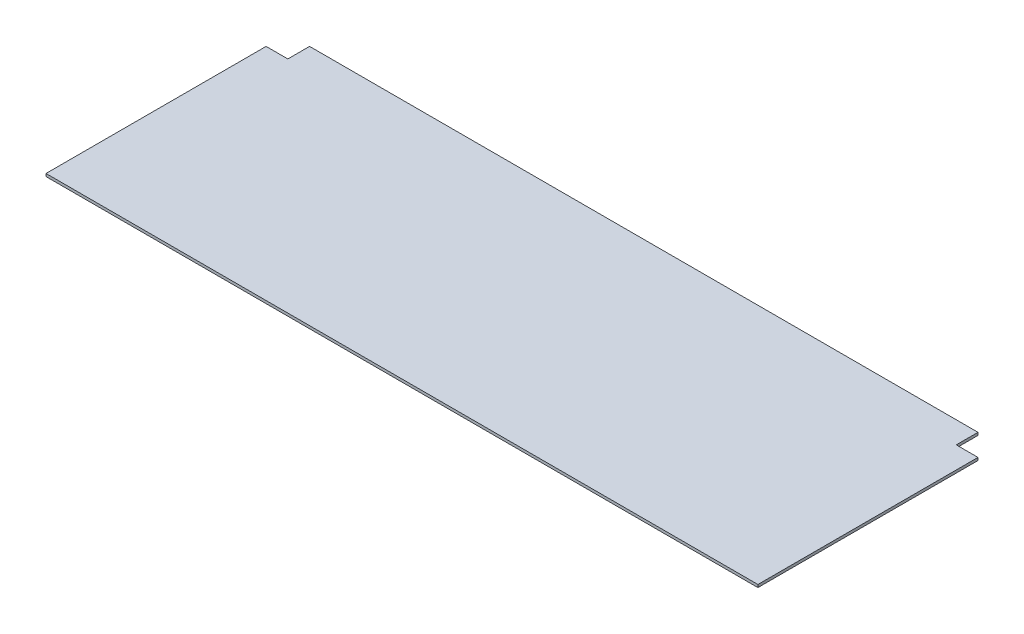
ISO-10303-21;
HEADER;
FILE_DESCRIPTION(('STEP AP214'),'2;1');
FILE_NAME('part.step','',(''),(''),'','','');
FILE_SCHEMA(('AUTOMOTIVE_DESIGN { 1 0 10303 214 1 1 1 1 }'));
ENDSEC;
DATA;
#1=APPLICATION_CONTEXT('core data for automotive mechanical design processes');
#2=APPLICATION_PROTOCOL_DEFINITION('international standard','automotive_design',2000,#1);
#3=PRODUCT_CONTEXT('',#1,'mechanical');
#4=PRODUCT('Part','Part','',(#3));
#5=PRODUCT_RELATED_PRODUCT_CATEGORY('part','',(#4));
#6=PRODUCT_DEFINITION_FORMATION('','',#4);
#7=PRODUCT_DEFINITION_CONTEXT('part definition',#1,'design');
#8=PRODUCT_DEFINITION('design','',#6,#7);
#9=PRODUCT_DEFINITION_SHAPE('','',#8);
#10=(LENGTH_UNIT() NAMED_UNIT(*) SI_UNIT(.MILLI.,.METRE.));
#11=(NAMED_UNIT(*) PLANE_ANGLE_UNIT() SI_UNIT($,.RADIAN.));
#12=(NAMED_UNIT(*) SI_UNIT($,.STERADIAN.) SOLID_ANGLE_UNIT());
#13=UNCERTAINTY_MEASURE_WITH_UNIT(LENGTH_MEASURE(1.E-05),#10,'distance_accuracy_value','');
#14=(GEOMETRIC_REPRESENTATION_CONTEXT(3) GLOBAL_UNCERTAINTY_ASSIGNED_CONTEXT((#13)) GLOBAL_UNIT_ASSIGNED_CONTEXT((#10,
#11,#12)) REPRESENTATION_CONTEXT('',''));
#15=CARTESIAN_POINT('',(0.,0.,0.));
#16=DIRECTION('',(0.,0.,1.));
#17=DIRECTION('',(1.,0.,0.));
#18=AXIS2_PLACEMENT_3D('',#15,#16,#17);
#19=CARTESIAN_POINT('',(0.,6.35,-282.575));
#20=DIRECTION('',(0.,0.,-1.));
#21=DIRECTION('',(-1.,0.,0.));
#22=AXIS2_PLACEMENT_3D('',#19,#20,#21);
#23=PLANE('',#22);
#24=DIRECTION('',(1.,0.,0.));
#25=VECTOR('',#24,1.);
#26=CARTESIAN_POINT('',(0.,0.,-282.575));
#27=LINE('',#26,#25);
#28=CARTESIAN_POINT('',(-781.05,0.,-282.575));
#29=VERTEX_POINT('',#28);
#30=CARTESIAN_POINT('',(781.05,0.,-282.575));
#31=VERTEX_POINT('',#30);
#32=EDGE_CURVE('E130',#29,#31,#27,.T.);
#33=ORIENTED_EDGE('',*,*,#32,.F.);
#34=DIRECTION('',(0.,-1.,0.));
#35=VECTOR('',#34,1.);
#36=CARTESIAN_POINT('',(-781.05,6.35,-282.575));
#37=LINE('',#36,#35);
#38=CARTESIAN_POINT('',(-781.05,6.35,-282.575));
#39=VERTEX_POINT('',#38);
#40=EDGE_CURVE('E11',#39,#29,#37,.T.);
#41=ORIENTED_EDGE('',*,*,#40,.F.);
#42=DIRECTION('',(1.,0.,0.));
#43=VECTOR('',#42,1.);
#44=CARTESIAN_POINT('',(0.,6.35,-282.575));
#45=LINE('',#44,#43);
#46=CARTESIAN_POINT('',(781.05,6.35,-282.575));
#47=VERTEX_POINT('',#46);
#48=EDGE_CURVE('E149',#39,#47,#45,.T.);
#49=ORIENTED_EDGE('',*,*,#48,.T.);
#50=DIRECTION('',(0.,-1.,0.));
#51=VECTOR('',#50,1.);
#52=CARTESIAN_POINT('',(781.05,6.35,-282.575));
#53=LINE('',#52,#51);
#54=EDGE_CURVE('E51',#47,#31,#53,.T.);
#55=ORIENTED_EDGE('',*,*,#54,.T.);
#56=EDGE_LOOP('',(#33,#41,#49,#55));
#57=FACE_BOUND('',#56,.T.);
#58=ADVANCED_FACE('F35',(#57),#23,.T.);
#59=CARTESIAN_POINT('',(-781.049999999999,6.35,1.70696790036118E-12));
#60=DIRECTION('',(1.,0.,0.));
#61=DIRECTION('',(0.,0.,-1.));
#62=AXIS2_PLACEMENT_3D('',#59,#60,#61);
#63=PLANE('',#62);
#64=DIRECTION('',(0.,0.,1.));
#65=VECTOR('',#64,1.);
#66=CARTESIAN_POINT('',(-781.049999999999,0.,1.70696790036118E-12));
#67=LINE('',#66,#65);
#68=CARTESIAN_POINT('',(-781.05,0.,-231.775));
#69=VERTEX_POINT('',#68);
#70=EDGE_CURVE('E132',#29,#69,#67,.T.);
#71=ORIENTED_EDGE('',*,*,#70,.T.);
#72=DIRECTION('',(0.,-1.,0.));
#73=VECTOR('',#72,1.);
#74=CARTESIAN_POINT('',(-781.05,6.35,-231.775));
#75=LINE('',#74,#73);
#76=CARTESIAN_POINT('',(-781.05,6.35,-231.775));
#77=VERTEX_POINT('',#76);
#78=EDGE_CURVE('E43',#77,#69,#75,.T.);
#79=ORIENTED_EDGE('',*,*,#78,.F.);
#80=DIRECTION('',(0.,0.,1.));
#81=VECTOR('',#80,1.);
#82=CARTESIAN_POINT('',(-781.049999999999,6.35,1.70696790036118E-12));
#83=LINE('',#82,#81);
#84=EDGE_CURVE('E174',#39,#77,#83,.T.);
#85=ORIENTED_EDGE('',*,*,#84,.F.);
#86=ORIENTED_EDGE('',*,*,#40,.T.);
#87=EDGE_LOOP('',(#71,#79,#85,#86));
#88=FACE_BOUND('',#87,.T.);
#89=ADVANCED_FACE('F165',(#88),#63,.F.);
#90=CARTESIAN_POINT('',(0.,6.35,-231.775));
#91=DIRECTION('',(0.,0.,-1.));
#92=DIRECTION('',(-1.,0.,0.));
#93=AXIS2_PLACEMENT_3D('',#90,#91,#92);
#94=PLANE('',#93);
#95=DIRECTION('',(1.,0.,0.));
#96=VECTOR('',#95,1.);
#97=CARTESIAN_POINT('',(0.,0.,-231.775));
#98=LINE('',#97,#96);
#99=CARTESIAN_POINT('',(-831.85,0.,-231.775));
#100=VERTEX_POINT('',#99);
#101=EDGE_CURVE('E135',#100,#69,#98,.T.);
#102=ORIENTED_EDGE('',*,*,#101,.F.);
#103=DIRECTION('',(0.,-1.,0.));
#104=VECTOR('',#103,1.);
#105=CARTESIAN_POINT('',(-831.85,6.35,-231.775));
#106=LINE('',#105,#104);
#107=CARTESIAN_POINT('',(-831.85,6.35,-231.775));
#108=VERTEX_POINT('',#107);
#109=EDGE_CURVE('E155',#108,#100,#106,.T.);
#110=ORIENTED_EDGE('',*,*,#109,.F.);
#111=DIRECTION('',(1.,0.,0.));
#112=VECTOR('',#111,1.);
#113=CARTESIAN_POINT('',(0.,6.35,-231.775));
#114=LINE('',#113,#112);
#115=EDGE_CURVE('E162',#108,#77,#114,.T.);
#116=ORIENTED_EDGE('',*,*,#115,.T.);
#117=ORIENTED_EDGE('',*,*,#78,.T.);
#118=EDGE_LOOP('',(#102,#110,#116,#117));
#119=FACE_BOUND('',#118,.T.);
#120=ADVANCED_FACE('F160',(#119),#94,.T.);
#121=CARTESIAN_POINT('',(-831.85,6.35,0.));
#122=DIRECTION('',(-1.,0.,0.));
#123=DIRECTION('',(0.,0.,1.));
#124=AXIS2_PLACEMENT_3D('',#121,#122,#123);
#125=PLANE('',#124);
#126=DIRECTION('',(0.,0.,-1.));
#127=VECTOR('',#126,1.);
#128=CARTESIAN_POINT('',(-831.85,0.,0.));
#129=LINE('',#128,#127);
#130=CARTESIAN_POINT('',(-831.85,0.,282.575));
#131=VERTEX_POINT('',#130);
#132=EDGE_CURVE('E138',#131,#100,#129,.T.);
#133=ORIENTED_EDGE('',*,*,#132,.F.);
#134=DIRECTION('',(0.,-1.,0.));
#135=VECTOR('',#134,1.);
#136=CARTESIAN_POINT('',(-831.85,6.35,282.575));
#137=LINE('',#136,#135);
#138=CARTESIAN_POINT('',(-831.85,6.35,282.575));
#139=VERTEX_POINT('',#138);
#140=EDGE_CURVE('E153',#139,#131,#137,.T.);
#141=ORIENTED_EDGE('',*,*,#140,.F.);
#142=DIRECTION('',(0.,0.,-1.));
#143=VECTOR('',#142,1.);
#144=CARTESIAN_POINT('',(-831.85,6.35,0.));
#145=LINE('',#144,#143);
#146=EDGE_CURVE('E173',#139,#108,#145,.T.);
#147=ORIENTED_EDGE('',*,*,#146,.T.);
#148=ORIENTED_EDGE('',*,*,#109,.T.);
#149=EDGE_LOOP('',(#133,#141,#147,#148));
#150=FACE_BOUND('',#149,.T.);
#151=ADVANCED_FACE('F171',(#150),#125,.T.);
#152=CARTESIAN_POINT('',(0.,6.35,282.575));
#153=DIRECTION('',(0.,0.,-1.));
#154=DIRECTION('',(-1.,0.,0.));
#155=AXIS2_PLACEMENT_3D('',#152,#153,#154);
#156=PLANE('',#155);
#157=DIRECTION('',(1.,0.,0.));
#158=VECTOR('',#157,1.);
#159=CARTESIAN_POINT('',(0.,0.,282.575));
#160=LINE('',#159,#158);
#161=CARTESIAN_POINT('',(831.85,0.,282.575));
#162=VERTEX_POINT('',#161);
#163=EDGE_CURVE('E141',#131,#162,#160,.T.);
#164=ORIENTED_EDGE('',*,*,#163,.T.);
#165=DIRECTION('',(0.,-1.,0.));
#166=VECTOR('',#165,1.);
#167=CARTESIAN_POINT('',(831.85,6.35,282.575));
#168=LINE('',#167,#166);
#169=CARTESIAN_POINT('',(831.85,6.35,282.575));
#170=VERTEX_POINT('',#169);
#171=EDGE_CURVE('E122',#170,#162,#168,.T.);
#172=ORIENTED_EDGE('',*,*,#171,.F.);
#173=DIRECTION('',(1.,0.,0.));
#174=VECTOR('',#173,1.);
#175=CARTESIAN_POINT('',(0.,6.35,282.575));
#176=LINE('',#175,#174);
#177=EDGE_CURVE('E110',#139,#170,#176,.T.);
#178=ORIENTED_EDGE('',*,*,#177,.F.);
#179=ORIENTED_EDGE('',*,*,#140,.T.);
#180=EDGE_LOOP('',(#164,#172,#178,#179));
#181=FACE_BOUND('',#180,.T.);
#182=ADVANCED_FACE('F200',(#181),#156,.F.);
#183=CARTESIAN_POINT('',(831.85,6.35,0.));
#184=DIRECTION('',(-1.,0.,0.));
#185=DIRECTION('',(0.,0.,1.));
#186=AXIS2_PLACEMENT_3D('',#183,#184,#185);
#187=PLANE('',#186);
#188=DIRECTION('',(0.,0.,-1.));
#189=VECTOR('',#188,1.);
#190=CARTESIAN_POINT('',(831.85,0.,0.));
#191=LINE('',#190,#189);
#192=CARTESIAN_POINT('',(831.85,0.,-231.775));
#193=VERTEX_POINT('',#192);
#194=EDGE_CURVE('E119',#162,#193,#191,.T.);
#195=ORIENTED_EDGE('',*,*,#194,.T.);
#196=DIRECTION('',(0.,-1.,0.));
#197=VECTOR('',#196,1.);
#198=CARTESIAN_POINT('',(831.85,6.35,-231.775));
#199=LINE('',#198,#197);
#200=CARTESIAN_POINT('',(831.85,6.35,-231.775));
#201=VERTEX_POINT('',#200);
#202=EDGE_CURVE('E116',#201,#193,#199,.T.);
#203=ORIENTED_EDGE('',*,*,#202,.F.);
#204=DIRECTION('',(0.,0.,-1.));
#205=VECTOR('',#204,1.);
#206=CARTESIAN_POINT('',(831.85,6.35,0.));
#207=LINE('',#206,#205);
#208=EDGE_CURVE('E101',#170,#201,#207,.T.);
#209=ORIENTED_EDGE('',*,*,#208,.F.);
#210=ORIENTED_EDGE('',*,*,#171,.T.);
#211=EDGE_LOOP('',(#195,#203,#209,#210));
#212=FACE_BOUND('',#211,.T.);
#213=ADVANCED_FACE('F117',(#212),#187,.F.);
#214=CARTESIAN_POINT('',(0.,6.35,-231.775));
#215=DIRECTION('',(0.,0.,1.));
#216=DIRECTION('',(1.,0.,0.));
#217=AXIS2_PLACEMENT_3D('',#214,#215,#216);
#218=PLANE('',#217);
#219=DIRECTION('',(-1.,0.,0.));
#220=VECTOR('',#219,1.);
#221=CARTESIAN_POINT('',(0.,0.,-231.775));
#222=LINE('',#221,#220);
#223=CARTESIAN_POINT('',(781.05,0.,-231.775));
#224=VERTEX_POINT('',#223);
#225=EDGE_CURVE('E144',#193,#224,#222,.T.);
#226=ORIENTED_EDGE('',*,*,#225,.T.);
#227=DIRECTION('',(0.,-1.,0.));
#228=VECTOR('',#227,1.);
#229=CARTESIAN_POINT('',(781.05,6.35,-231.775));
#230=LINE('',#229,#228);
#231=CARTESIAN_POINT('',(781.05,6.35,-231.775));
#232=VERTEX_POINT('',#231);
#233=EDGE_CURVE('E77',#232,#224,#230,.T.);
#234=ORIENTED_EDGE('',*,*,#233,.F.);
#235=DIRECTION('',(-1.,0.,0.));
#236=VECTOR('',#235,1.);
#237=CARTESIAN_POINT('',(0.,6.35,-231.775));
#238=LINE('',#237,#236);
#239=EDGE_CURVE('E107',#201,#232,#238,.T.);
#240=ORIENTED_EDGE('',*,*,#239,.F.);
#241=ORIENTED_EDGE('',*,*,#202,.T.);
#242=EDGE_LOOP('',(#226,#234,#240,#241));
#243=FACE_BOUND('',#242,.T.);
#244=ADVANCED_FACE('F124',(#243),#218,.F.);
#245=CARTESIAN_POINT('',(781.05,6.35,0.));
#246=DIRECTION('',(1.,0.,0.));
#247=DIRECTION('',(0.,0.,-1.));
#248=AXIS2_PLACEMENT_3D('',#245,#246,#247);
#249=PLANE('',#248);
#250=DIRECTION('',(0.,0.,1.));
#251=VECTOR('',#250,1.);
#252=CARTESIAN_POINT('',(781.05,0.,0.));
#253=LINE('',#252,#251);
#254=EDGE_CURVE('E146',#31,#224,#253,.T.);
#255=ORIENTED_EDGE('',*,*,#254,.F.);
#256=ORIENTED_EDGE('',*,*,#54,.F.);
#257=DIRECTION('',(0.,0.,1.));
#258=VECTOR('',#257,1.);
#259=CARTESIAN_POINT('',(781.05,6.35,0.));
#260=LINE('',#259,#258);
#261=EDGE_CURVE('E125',#47,#232,#260,.T.);
#262=ORIENTED_EDGE('',*,*,#261,.T.);
#263=ORIENTED_EDGE('',*,*,#233,.T.);
#264=EDGE_LOOP('',(#255,#256,#262,#263));
#265=FACE_BOUND('',#264,.T.);
#266=ADVANCED_FACE('F179',(#265),#249,.T.);
#267=CARTESIAN_POINT('',(0.,6.35,0.));
#268=DIRECTION('',(0.,1.,0.));
#269=DIRECTION('',(0.,0.,1.));
#270=AXIS2_PLACEMENT_3D('',#267,#268,#269);
#271=PLANE('',#270);
#272=ORIENTED_EDGE('',*,*,#48,.F.);
#273=ORIENTED_EDGE('',*,*,#84,.T.);
#274=ORIENTED_EDGE('',*,*,#115,.F.);
#275=ORIENTED_EDGE('',*,*,#146,.F.);
#276=ORIENTED_EDGE('',*,*,#177,.T.);
#277=ORIENTED_EDGE('',*,*,#208,.T.);
#278=ORIENTED_EDGE('',*,*,#239,.T.);
#279=ORIENTED_EDGE('',*,*,#261,.F.);
#280=EDGE_LOOP('',(#272,#273,#274,#275,#276,#277,#278,#279));
#281=FACE_BOUND('',#280,.T.);
#282=ADVANCED_FACE('F104',(#281),#271,.T.);
#283=CARTESIAN_POINT('',(0.,0.,0.));
#284=DIRECTION('',(0.,1.,0.));
#285=DIRECTION('',(0.,0.,1.));
#286=AXIS2_PLACEMENT_3D('',#283,#284,#285);
#287=PLANE('',#286);
#288=ORIENTED_EDGE('',*,*,#32,.T.);
#289=ORIENTED_EDGE('',*,*,#254,.T.);
#290=ORIENTED_EDGE('',*,*,#225,.F.);
#291=ORIENTED_EDGE('',*,*,#194,.F.);
#292=ORIENTED_EDGE('',*,*,#163,.F.);
#293=ORIENTED_EDGE('',*,*,#132,.T.);
#294=ORIENTED_EDGE('',*,*,#101,.T.);
#295=ORIENTED_EDGE('',*,*,#70,.F.);
#296=EDGE_LOOP('',(#288,#289,#290,#291,#292,#293,#294,#295));
#297=FACE_BOUND('',#296,.T.);
#298=ADVANCED_FACE('F167',(#297),#287,.F.);
#299=CLOSED_SHELL('',(#58,#89,#120,#151,#182,#213,#244,#266,#282,#298));
#300=MANIFOLD_SOLID_BREP('B2',#299);
#301=ADVANCED_BREP_SHAPE_REPRESENTATION('',(#18,#300),#14);
#302=SHAPE_DEFINITION_REPRESENTATION(#9,#301);
ENDSEC;
END-ISO-10303-21;
